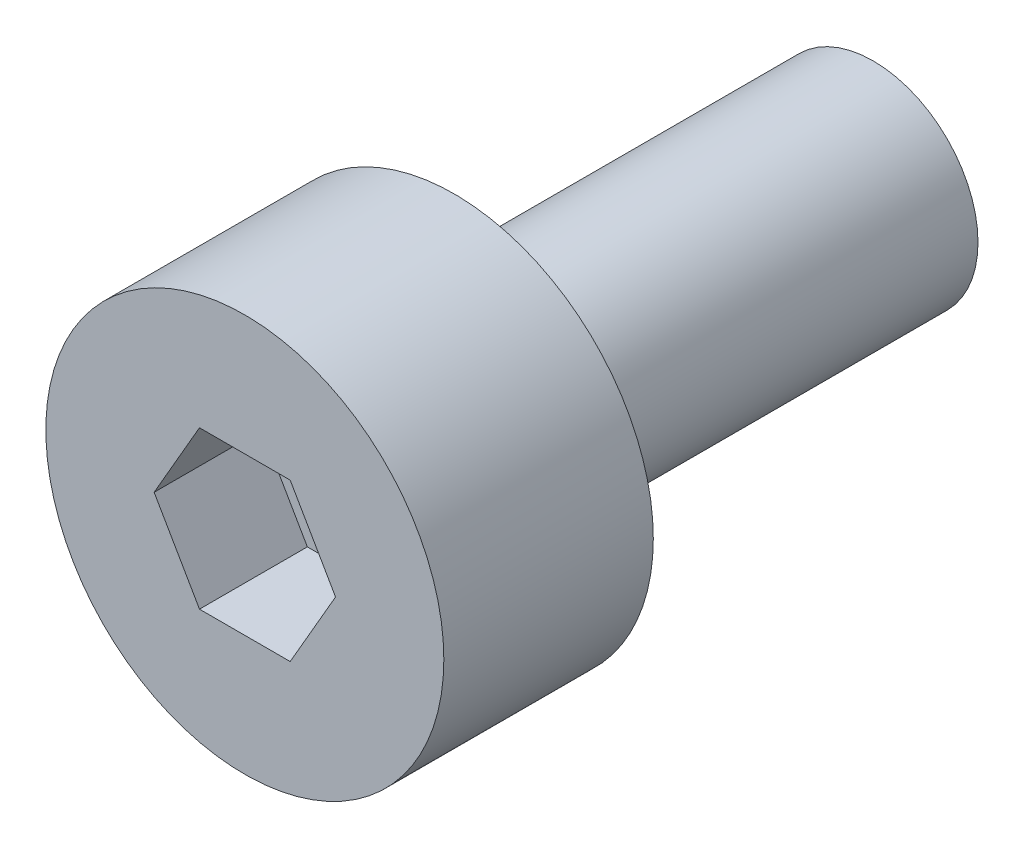
ISO-10303-21;
HEADER;
FILE_DESCRIPTION(('STEP AP214'),'2;1');
FILE_NAME('part.step','',(''),(''),'','','');
FILE_SCHEMA(('AUTOMOTIVE_DESIGN { 1 0 10303 214 1 1 1 1 }'));
ENDSEC;
DATA;
#1=APPLICATION_CONTEXT('core data for automotive mechanical design processes');
#2=APPLICATION_PROTOCOL_DEFINITION('international standard','automotive_design',2000,#1);
#3=PRODUCT_CONTEXT('',#1,'mechanical');
#4=PRODUCT('Part','Part','',(#3));
#5=PRODUCT_RELATED_PRODUCT_CATEGORY('part','',(#4));
#6=PRODUCT_DEFINITION_FORMATION('','',#4);
#7=PRODUCT_DEFINITION_CONTEXT('part definition',#1,'design');
#8=PRODUCT_DEFINITION('design','',#6,#7);
#9=PRODUCT_DEFINITION_SHAPE('','',#8);
#10=(LENGTH_UNIT() NAMED_UNIT(*) SI_UNIT(.MILLI.,.METRE.));
#11=(NAMED_UNIT(*) PLANE_ANGLE_UNIT() SI_UNIT($,.RADIAN.));
#12=(NAMED_UNIT(*) SI_UNIT($,.STERADIAN.) SOLID_ANGLE_UNIT());
#13=UNCERTAINTY_MEASURE_WITH_UNIT(LENGTH_MEASURE(1.E-05),#10,'distance_accuracy_value','');
#14=(GEOMETRIC_REPRESENTATION_CONTEXT(3) GLOBAL_UNCERTAINTY_ASSIGNED_CONTEXT((#13)) GLOBAL_UNIT_ASSIGNED_CONTEXT((#10,
#11,#12)) REPRESENTATION_CONTEXT('',''));
#15=CARTESIAN_POINT('',(0.,0.,0.));
#16=DIRECTION('',(0.,0.,1.));
#17=DIRECTION('',(1.,0.,0.));
#18=AXIS2_PLACEMENT_3D('',#15,#16,#17);
#19=CARTESIAN_POINT('',(0.,0.,2.));
#20=DIRECTION('',(0.,0.,1.));
#21=DIRECTION('',(1.,0.,0.));
#22=AXIS2_PLACEMENT_3D('',#19,#20,#21);
#23=PLANE('',#22);
#24=CARTESIAN_POINT('',(0.,0.,2.));
#25=DIRECTION('',(0.,0.,1.));
#26=DIRECTION('',(1.,0.,0.));
#27=AXIS2_PLACEMENT_3D('',#24,#25,#26);
#28=CIRCLE('',#27,1.9);
#29=CARTESIAN_POINT('',(1.9,0.,2.));
#30=VERTEX_POINT('',#29);
#31=EDGE_CURVE('E11',#30,#30,#28,.T.);
#32=ORIENTED_EDGE('',*,*,#31,.T.);
#33=EDGE_LOOP('',(#32));
#34=FACE_BOUND('',#33,.T.);
#35=DIRECTION('',(-0.5,0.866025403784439,0.));
#36=VECTOR('',#35,1.);
#37=CARTESIAN_POINT('',(0.866025403784439,0.,2.));
#38=LINE('',#37,#36);
#39=CARTESIAN_POINT('',(0.866025403784439,0.,2.));
#40=VERTEX_POINT('',#39);
#41=CARTESIAN_POINT('',(0.433012701892219,0.75,2.));
#42=VERTEX_POINT('',#41);
#43=EDGE_CURVE('E124',#40,#42,#38,.T.);
#44=ORIENTED_EDGE('',*,*,#43,.F.);
#45=DIRECTION('',(0.5,0.866025403784439,0.));
#46=VECTOR('',#45,1.);
#47=CARTESIAN_POINT('',(0.433012701892219,-0.75,2.));
#48=LINE('',#47,#46);
#49=CARTESIAN_POINT('',(0.433012701892219,-0.75,2.));
#50=VERTEX_POINT('',#49);
#51=EDGE_CURVE('E101',#50,#40,#48,.T.);
#52=ORIENTED_EDGE('',*,*,#51,.F.);
#53=DIRECTION('',(1.,0.,0.));
#54=VECTOR('',#53,1.);
#55=CARTESIAN_POINT('',(-0.43301270189222,-0.75,2.));
#56=LINE('',#55,#54);
#57=CARTESIAN_POINT('',(-0.43301270189222,-0.75,2.));
#58=VERTEX_POINT('',#57);
#59=EDGE_CURVE('E70',#58,#50,#56,.T.);
#60=ORIENTED_EDGE('',*,*,#59,.F.);
#61=DIRECTION('',(0.5,-0.866025403784439,0.));
#62=VECTOR('',#61,1.);
#63=CARTESIAN_POINT('',(-0.866025403784439,0.,2.));
#64=LINE('',#63,#62);
#65=CARTESIAN_POINT('',(-0.866025403784439,0.,2.));
#66=VERTEX_POINT('',#65);
#67=EDGE_CURVE('E135',#66,#58,#64,.T.);
#68=ORIENTED_EDGE('',*,*,#67,.F.);
#69=DIRECTION('',(-0.5,-0.866025403784439,0.));
#70=VECTOR('',#69,1.);
#71=CARTESIAN_POINT('',(-0.433012701892219,0.75,2.));
#72=LINE('',#71,#70);
#73=CARTESIAN_POINT('',(-0.433012701892219,0.75,2.));
#74=VERTEX_POINT('',#73);
#75=EDGE_CURVE('E122',#74,#66,#72,.T.);
#76=ORIENTED_EDGE('',*,*,#75,.F.);
#77=DIRECTION('',(-1.,0.,0.));
#78=VECTOR('',#77,1.);
#79=CARTESIAN_POINT('',(0.433012701892219,0.75,2.));
#80=LINE('',#79,#78);
#81=EDGE_CURVE('E109',#42,#74,#80,.T.);
#82=ORIENTED_EDGE('',*,*,#81,.F.);
#83=EDGE_LOOP('',(#44,#52,#60,#68,#76,#82));
#84=FACE_BOUND('',#83,.T.);
#85=ADVANCED_FACE('F50',(#34,#84),#23,.T.);
#86=CARTESIAN_POINT('',(0.,0.,2.));
#87=DIRECTION('',(0.,0.,-1.));
#88=DIRECTION('',(-1.,0.,0.));
#89=AXIS2_PLACEMENT_3D('',#86,#87,#88);
#90=CYLINDRICAL_SURFACE('',#89,1.9);
#91=ORIENTED_EDGE('',*,*,#31,.F.);
#92=EDGE_LOOP('',(#91));
#93=FACE_BOUND('',#92,.T.);
#94=CARTESIAN_POINT('',(0.,0.,0.));
#95=DIRECTION('',(0.,0.,1.));
#96=DIRECTION('',(1.,0.,0.));
#97=AXIS2_PLACEMENT_3D('',#94,#95,#96);
#98=CIRCLE('',#97,1.9);
#99=CARTESIAN_POINT('',(1.9,0.,0.));
#100=VERTEX_POINT('',#99);
#101=EDGE_CURVE('E51',#100,#100,#98,.T.);
#102=ORIENTED_EDGE('',*,*,#101,.T.);
#103=EDGE_LOOP('',(#102));
#104=FACE_BOUND('',#103,.T.);
#105=ADVANCED_FACE('F47',(#93,#104),#90,.T.);
#106=CARTESIAN_POINT('',(0.,0.,0.));
#107=DIRECTION('',(0.,0.,1.));
#108=DIRECTION('',(1.,0.,0.));
#109=AXIS2_PLACEMENT_3D('',#106,#107,#108);
#110=PLANE('',#109);
#111=CARTESIAN_POINT('',(0.,0.,0.));
#112=DIRECTION('',(0.,0.,1.));
#113=DIRECTION('',(1.,0.,0.));
#114=AXIS2_PLACEMENT_3D('',#111,#112,#113);
#115=CIRCLE('',#114,1.);
#116=CARTESIAN_POINT('',(1.,0.,0.));
#117=VERTEX_POINT('',#116);
#118=EDGE_CURVE('E156',#117,#117,#115,.T.);
#119=ORIENTED_EDGE('',*,*,#118,.T.);
#120=EDGE_LOOP('',(#119));
#121=FACE_BOUND('',#120,.T.);
#122=ORIENTED_EDGE('',*,*,#101,.F.);
#123=EDGE_LOOP('',(#122));
#124=FACE_BOUND('',#123,.T.);
#125=ADVANCED_FACE('F174',(#121,#124),#110,.F.);
#126=CARTESIAN_POINT('',(0.,0.,0.));
#127=DIRECTION('',(0.,0.,-1.));
#128=DIRECTION('',(-1.,0.,0.));
#129=AXIS2_PLACEMENT_3D('',#126,#127,#128);
#130=CYLINDRICAL_SURFACE('',#129,1.);
#131=ORIENTED_EDGE('',*,*,#118,.F.);
#132=EDGE_LOOP('',(#131));
#133=FACE_BOUND('',#132,.T.);
#134=CARTESIAN_POINT('',(0.,0.,-4.));
#135=DIRECTION('',(0.,0.,1.));
#136=DIRECTION('',(1.,0.,0.));
#137=AXIS2_PLACEMENT_3D('',#134,#135,#136);
#138=CIRCLE('',#137,1.);
#139=CARTESIAN_POINT('',(1.,0.,-4.));
#140=VERTEX_POINT('',#139);
#141=EDGE_CURVE('E154',#140,#140,#138,.T.);
#142=ORIENTED_EDGE('',*,*,#141,.T.);
#143=EDGE_LOOP('',(#142));
#144=FACE_BOUND('',#143,.T.);
#145=ADVANCED_FACE('F165',(#133,#144),#130,.T.);
#146=CARTESIAN_POINT('',(0.,0.,-4.));
#147=DIRECTION('',(0.,0.,1.));
#148=DIRECTION('',(1.,0.,0.));
#149=AXIS2_PLACEMENT_3D('',#146,#147,#148);
#150=PLANE('',#149);
#151=ORIENTED_EDGE('',*,*,#141,.F.);
#152=EDGE_LOOP('',(#151));
#153=FACE_BOUND('',#152,.T.);
#154=ADVANCED_FACE('F163',(#153),#150,.F.);
#155=CARTESIAN_POINT('',(0.433012701892219,-0.75,2.));
#156=DIRECTION('',(-0.866025403784439,0.5,0.));
#157=DIRECTION('',(-0.5,-0.866025403784439,0.));
#158=AXIS2_PLACEMENT_3D('',#155,#156,#157);
#159=PLANE('',#158);
#160=DIRECTION('',(0.5,0.866025403784439,0.));
#161=VECTOR('',#160,1.);
#162=CARTESIAN_POINT('',(0.433012701892219,-0.75,0.97));
#163=LINE('',#162,#161);
#164=CARTESIAN_POINT('',(0.433012701892219,-0.75,0.97));
#165=VERTEX_POINT('',#164);
#166=CARTESIAN_POINT('',(0.866025403784439,0.,0.97));
#167=VERTEX_POINT('',#166);
#168=EDGE_CURVE('E136',#165,#167,#163,.T.);
#169=ORIENTED_EDGE('',*,*,#168,.F.);
#170=DIRECTION('',(0.,0.,-1.));
#171=VECTOR('',#170,1.);
#172=CARTESIAN_POINT('',(0.433012701892219,-0.75,2.));
#173=LINE('',#172,#171);
#174=EDGE_CURVE('E140',#50,#165,#173,.T.);
#175=ORIENTED_EDGE('',*,*,#174,.F.);
#176=ORIENTED_EDGE('',*,*,#51,.T.);
#177=DIRECTION('',(0.,0.,-1.));
#178=VECTOR('',#177,1.);
#179=CARTESIAN_POINT('',(0.866025403784439,0.,2.));
#180=LINE('',#179,#178);
#181=EDGE_CURVE('E153',#40,#167,#180,.T.);
#182=ORIENTED_EDGE('',*,*,#181,.T.);
#183=EDGE_LOOP('',(#169,#175,#176,#182));
#184=FACE_BOUND('',#183,.T.);
#185=ADVANCED_FACE('F167',(#184),#159,.T.);
#186=CARTESIAN_POINT('',(0.866025403784439,0.,2.));
#187=DIRECTION('',(-0.866025403784439,-0.5,0.));
#188=DIRECTION('',(0.5,-0.866025403784439,0.));
#189=AXIS2_PLACEMENT_3D('',#186,#187,#188);
#190=PLANE('',#189);
#191=DIRECTION('',(-0.5,0.866025403784439,0.));
#192=VECTOR('',#191,1.);
#193=CARTESIAN_POINT('',(0.866025403784439,0.,0.97));
#194=LINE('',#193,#192);
#195=CARTESIAN_POINT('',(0.433012701892219,0.75,0.97));
#196=VERTEX_POINT('',#195);
#197=EDGE_CURVE('E143',#167,#196,#194,.T.);
#198=ORIENTED_EDGE('',*,*,#197,.F.);
#199=ORIENTED_EDGE('',*,*,#181,.F.);
#200=ORIENTED_EDGE('',*,*,#43,.T.);
#201=DIRECTION('',(0.,0.,-1.));
#202=VECTOR('',#201,1.);
#203=CARTESIAN_POINT('',(0.433012701892219,0.75,2.));
#204=LINE('',#203,#202);
#205=EDGE_CURVE('E120',#42,#196,#204,.T.);
#206=ORIENTED_EDGE('',*,*,#205,.T.);
#207=EDGE_LOOP('',(#198,#199,#200,#206));
#208=FACE_BOUND('',#207,.T.);
#209=ADVANCED_FACE('F175',(#208),#190,.T.);
#210=CARTESIAN_POINT('',(0.433012701892219,0.75,2.));
#211=DIRECTION('',(0.,-1.,0.));
#212=DIRECTION('',(1.,0.,0.));
#213=AXIS2_PLACEMENT_3D('',#210,#211,#212);
#214=PLANE('',#213);
#215=DIRECTION('',(-1.,0.,0.));
#216=VECTOR('',#215,1.);
#217=CARTESIAN_POINT('',(0.433012701892219,0.75,0.97));
#218=LINE('',#217,#216);
#219=CARTESIAN_POINT('',(-0.433012701892219,0.75,0.97));
#220=VERTEX_POINT('',#219);
#221=EDGE_CURVE('E141',#196,#220,#218,.T.);
#222=ORIENTED_EDGE('',*,*,#221,.F.);
#223=ORIENTED_EDGE('',*,*,#205,.F.);
#224=ORIENTED_EDGE('',*,*,#81,.T.);
#225=DIRECTION('',(0.,0.,-1.));
#226=VECTOR('',#225,1.);
#227=CARTESIAN_POINT('',(-0.433012701892219,0.75,2.));
#228=LINE('',#227,#226);
#229=EDGE_CURVE('E111',#74,#220,#228,.T.);
#230=ORIENTED_EDGE('',*,*,#229,.T.);
#231=EDGE_LOOP('',(#222,#223,#224,#230));
#232=FACE_BOUND('',#231,.T.);
#233=ADVANCED_FACE('F114',(#232),#214,.T.);
#234=CARTESIAN_POINT('',(-0.433012701892219,0.75,2.));
#235=DIRECTION('',(0.866025403784439,-0.5,0.));
#236=DIRECTION('',(0.5,0.866025403784439,0.));
#237=AXIS2_PLACEMENT_3D('',#234,#235,#236);
#238=PLANE('',#237);
#239=DIRECTION('',(-0.5,-0.866025403784439,0.));
#240=VECTOR('',#239,1.);
#241=CARTESIAN_POINT('',(-0.433012701892219,0.75,0.97));
#242=LINE('',#241,#240);
#243=CARTESIAN_POINT('',(-0.866025403784439,0.,0.97));
#244=VERTEX_POINT('',#243);
#245=EDGE_CURVE('E126',#220,#244,#242,.T.);
#246=ORIENTED_EDGE('',*,*,#245,.F.);
#247=ORIENTED_EDGE('',*,*,#229,.F.);
#248=ORIENTED_EDGE('',*,*,#75,.T.);
#249=DIRECTION('',(0.,0.,-1.));
#250=VECTOR('',#249,1.);
#251=CARTESIAN_POINT('',(-0.866025403784439,0.,2.));
#252=LINE('',#251,#250);
#253=EDGE_CURVE('E129',#66,#244,#252,.T.);
#254=ORIENTED_EDGE('',*,*,#253,.T.);
#255=EDGE_LOOP('',(#246,#247,#248,#254));
#256=FACE_BOUND('',#255,.T.);
#257=ADVANCED_FACE('F123',(#256),#238,.T.);
#258=CARTESIAN_POINT('',(-0.866025403784439,0.,2.));
#259=DIRECTION('',(0.866025403784439,0.5,0.));
#260=DIRECTION('',(-0.5,0.866025403784439,0.));
#261=AXIS2_PLACEMENT_3D('',#258,#259,#260);
#262=PLANE('',#261);
#263=DIRECTION('',(0.5,-0.866025403784439,0.));
#264=VECTOR('',#263,1.);
#265=CARTESIAN_POINT('',(-0.866025403784439,0.,0.97));
#266=LINE('',#265,#264);
#267=CARTESIAN_POINT('',(-0.43301270189222,-0.75,0.97));
#268=VERTEX_POINT('',#267);
#269=EDGE_CURVE('E148',#244,#268,#266,.T.);
#270=ORIENTED_EDGE('',*,*,#269,.F.);
#271=ORIENTED_EDGE('',*,*,#253,.F.);
#272=ORIENTED_EDGE('',*,*,#67,.T.);
#273=DIRECTION('',(0.,0.,-1.));
#274=VECTOR('',#273,1.);
#275=CARTESIAN_POINT('',(-0.43301270189222,-0.75,2.));
#276=LINE('',#275,#274);
#277=EDGE_CURVE('E65',#58,#268,#276,.T.);
#278=ORIENTED_EDGE('',*,*,#277,.T.);
#279=EDGE_LOOP('',(#270,#271,#272,#278));
#280=FACE_BOUND('',#279,.T.);
#281=ADVANCED_FACE('F277',(#280),#262,.T.);
#282=CARTESIAN_POINT('',(-0.43301270189222,-0.75,2.));
#283=DIRECTION('',(0.,1.,0.));
#284=DIRECTION('',(-1.,0.,0.));
#285=AXIS2_PLACEMENT_3D('',#282,#283,#284);
#286=PLANE('',#285);
#287=DIRECTION('',(1.,0.,0.));
#288=VECTOR('',#287,1.);
#289=CARTESIAN_POINT('',(-0.43301270189222,-0.75,0.97));
#290=LINE('',#289,#288);
#291=EDGE_CURVE('E94',#268,#165,#290,.T.);
#292=ORIENTED_EDGE('',*,*,#291,.F.);
#293=ORIENTED_EDGE('',*,*,#277,.F.);
#294=ORIENTED_EDGE('',*,*,#59,.T.);
#295=ORIENTED_EDGE('',*,*,#174,.T.);
#296=EDGE_LOOP('',(#292,#293,#294,#295));
#297=FACE_BOUND('',#296,.T.);
#298=ADVANCED_FACE('F282',(#297),#286,.T.);
#299=CARTESIAN_POINT('',(0.,0.,0.97));
#300=DIRECTION('',(0.,0.,1.));
#301=DIRECTION('',(1.,0.,0.));
#302=AXIS2_PLACEMENT_3D('',#299,#300,#301);
#303=PLANE('',#302);
#304=ORIENTED_EDGE('',*,*,#168,.T.);
#305=ORIENTED_EDGE('',*,*,#197,.T.);
#306=ORIENTED_EDGE('',*,*,#221,.T.);
#307=ORIENTED_EDGE('',*,*,#245,.T.);
#308=ORIENTED_EDGE('',*,*,#269,.T.);
#309=ORIENTED_EDGE('',*,*,#291,.T.);
#310=EDGE_LOOP('',(#304,#305,#306,#307,#308,#309));
#311=FACE_BOUND('',#310,.T.);
#312=ADVANCED_FACE('F293',(#311),#303,.T.);
#313=CLOSED_SHELL('',(#85,#105,#125,#145,#154,#185,#209,#233,#257,#281,#298,#312));
#314=MANIFOLD_SOLID_BREP('B2',#313);
#315=ADVANCED_BREP_SHAPE_REPRESENTATION('',(#18,#314),#14);
#316=SHAPE_DEFINITION_REPRESENTATION(#9,#315);
ENDSEC;
END-ISO-10303-21;
